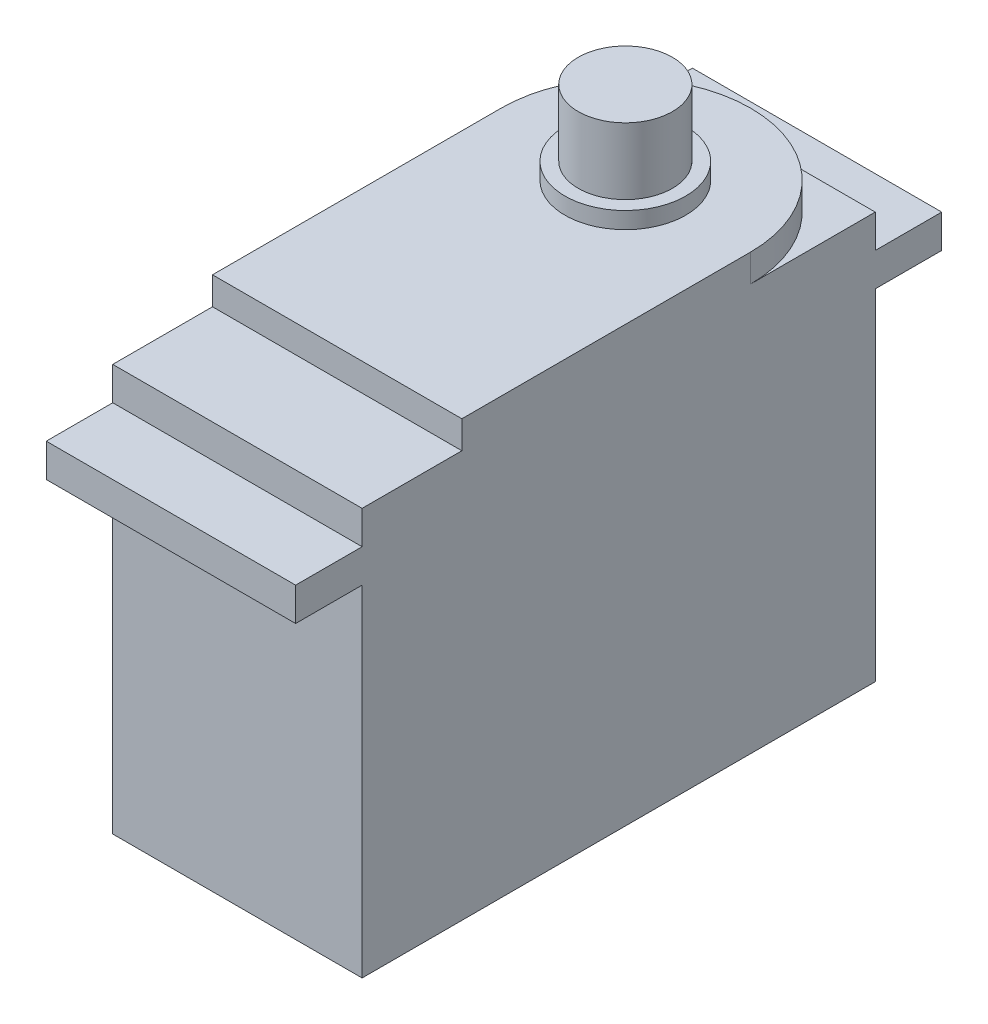
ISO-10303-21;
HEADER;
FILE_DESCRIPTION(('STEP AP214'),'2;1');
FILE_NAME('part.step','',(''),(''),'','','');
FILE_SCHEMA(('AUTOMOTIVE_DESIGN { 1 0 10303 214 1 1 1 1 }'));
ENDSEC;
DATA;
#1=APPLICATION_CONTEXT('core data for automotive mechanical design processes');
#2=APPLICATION_PROTOCOL_DEFINITION('international standard','automotive_design',2000,#1);
#3=PRODUCT_CONTEXT('',#1,'mechanical');
#4=PRODUCT('Part','Part','',(#3));
#5=PRODUCT_RELATED_PRODUCT_CATEGORY('part','',(#4));
#6=PRODUCT_DEFINITION_FORMATION('','',#4);
#7=PRODUCT_DEFINITION_CONTEXT('part definition',#1,'design');
#8=PRODUCT_DEFINITION('design','',#6,#7);
#9=PRODUCT_DEFINITION_SHAPE('','',#8);
#10=(LENGTH_UNIT() NAMED_UNIT(*) SI_UNIT(.MILLI.,.METRE.));
#11=(NAMED_UNIT(*) PLANE_ANGLE_UNIT() SI_UNIT($,.RADIAN.));
#12=(NAMED_UNIT(*) SI_UNIT($,.STERADIAN.) SOLID_ANGLE_UNIT());
#13=UNCERTAINTY_MEASURE_WITH_UNIT(LENGTH_MEASURE(1.E-05),#10,'distance_accuracy_value','');
#14=(GEOMETRIC_REPRESENTATION_CONTEXT(3) GLOBAL_UNCERTAINTY_ASSIGNED_CONTEXT((#13)) GLOBAL_UNIT_ASSIGNED_CONTEXT((#10,
#11,#12)) REPRESENTATION_CONTEXT('',''));
#15=CARTESIAN_POINT('',(0.,0.,0.));
#16=DIRECTION('',(0.,0.,1.));
#17=DIRECTION('',(1.,0.,0.));
#18=AXIS2_PLACEMENT_3D('',#15,#16,#17);
#19=CARTESIAN_POINT('',(0.,51.689,-15.0495));
#20=DIRECTION('',(0.,1.,0.));
#21=DIRECTION('',(0.,0.,1.));
#22=AXIS2_PLACEMENT_3D('',#19,#20,#21);
#23=PLANE('',#22);
#24=CARTESIAN_POINT('',(0.,51.689,-15.0495));
#25=DIRECTION('',(0.,1.,0.));
#26=DIRECTION('',(0.,0.,1.));
#27=AXIS2_PLACEMENT_3D('',#24,#25,#26);
#28=CIRCLE('',#27,6.9215);
#29=CARTESIAN_POINT('',(0.,51.689,-21.971));
#30=VERTEX_POINT('',#29);
#31=EDGE_CURVE('E187',#30,#30,#28,.T.);
#32=ORIENTED_EDGE('',*,*,#31,.T.);
#33=EDGE_LOOP('',(#32));
#34=FACE_BOUND('',#33,.T.);
#35=CARTESIAN_POINT('',(0.,51.689,-15.0495));
#36=DIRECTION('',(0.,1.,0.));
#37=DIRECTION('',(0.,0.,1.));
#38=AXIS2_PLACEMENT_3D('',#35,#36,#37);
#39=CIRCLE('',#38,5.3975);
#40=CARTESIAN_POINT('',(0.,51.689,-20.447));
#41=VERTEX_POINT('',#40);
#42=EDGE_CURVE('E214',#41,#41,#39,.T.);
#43=ORIENTED_EDGE('',*,*,#42,.F.);
#44=EDGE_LOOP('',(#43));
#45=FACE_BOUND('',#44,.T.);
#46=ADVANCED_FACE('F33',(#34,#45),#23,.T.);
#47=CARTESIAN_POINT('',(0.,49.784,-15.113));
#48=DIRECTION('',(0.,-1.,0.));
#49=DIRECTION('',(0.,0.,-1.));
#50=AXIS2_PLACEMENT_3D('',#47,#48,#49);
#51=PLANE('',#50);
#52=CARTESIAN_POINT('',(0.,49.784,-15.113));
#53=DIRECTION('',(0.,1.,0.));
#54=DIRECTION('',(0.,0.,-1.));
#55=AXIS2_PLACEMENT_3D('',#52,#53,#54);
#56=CIRCLE('',#55,14.2875);
#57=CARTESIAN_POINT('',(14.2875,49.784,-15.113));
#58=VERTEX_POINT('',#57);
#59=CARTESIAN_POINT('',(-14.2875,49.784,-15.113));
#60=VERTEX_POINT('',#59);
#61=EDGE_CURVE('E160',#58,#60,#56,.T.);
#62=ORIENTED_EDGE('',*,*,#61,.T.);
#63=DIRECTION('',(0.,0.,1.));
#64=VECTOR('',#63,1.);
#65=CARTESIAN_POINT('',(-14.2875,49.784,-15.113));
#66=LINE('',#65,#64);
#67=CARTESIAN_POINT('',(-14.2875,49.784,17.9705));
#68=VERTEX_POINT('',#67);
#69=EDGE_CURVE('E149',#60,#68,#66,.T.);
#70=ORIENTED_EDGE('',*,*,#69,.T.);
#71=DIRECTION('',(1.,0.,0.));
#72=VECTOR('',#71,1.);
#73=CARTESIAN_POINT('',(-14.2875,49.784,17.9705));
#74=LINE('',#73,#72);
#75=CARTESIAN_POINT('',(14.2875,49.784,17.9705));
#76=VERTEX_POINT('',#75);
#77=EDGE_CURVE('E159',#68,#76,#74,.T.);
#78=ORIENTED_EDGE('',*,*,#77,.T.);
#79=DIRECTION('',(0.,0.,-1.));
#80=VECTOR('',#79,1.);
#81=CARTESIAN_POINT('',(14.2875,49.784,17.9705));
#82=LINE('',#81,#80);
#83=EDGE_CURVE('E166',#76,#58,#82,.T.);
#84=ORIENTED_EDGE('',*,*,#83,.T.);
#85=EDGE_LOOP('',(#62,#70,#78,#84));
#86=FACE_BOUND('',#85,.T.);
#87=CARTESIAN_POINT('',(0.,49.784,-15.0495));
#88=DIRECTION('',(0.,-1.,0.));
#89=DIRECTION('',(0.,0.,-1.));
#90=AXIS2_PLACEMENT_3D('',#87,#88,#89);
#91=CIRCLE('',#90,6.9215);
#92=CARTESIAN_POINT('',(0.,49.784,-21.971));
#93=VERTEX_POINT('',#92);
#94=EDGE_CURVE('E11',#93,#93,#91,.F.);
#95=ORIENTED_EDGE('',*,*,#94,.F.);
#96=EDGE_LOOP('',(#95));
#97=FACE_BOUND('',#96,.T.);
#98=ADVANCED_FACE('F163',(#86,#97),#51,.F.);
#99=CARTESIAN_POINT('',(0.,46.609,0.));
#100=DIRECTION('',(0.,-1.,0.));
#101=DIRECTION('',(0.,0.,-1.));
#102=AXIS2_PLACEMENT_3D('',#99,#100,#101);
#103=PLANE('',#102);
#104=CARTESIAN_POINT('',(0.,46.609,-15.113));
#105=DIRECTION('',(0.,1.,0.));
#106=DIRECTION('',(0.,0.,-1.));
#107=AXIS2_PLACEMENT_3D('',#104,#105,#106);
#108=CIRCLE('',#107,14.2875);
#109=CARTESIAN_POINT('',(14.2875,46.609,-15.113));
#110=VERTEX_POINT('',#109);
#111=CARTESIAN_POINT('',(0.,46.609,-29.4005));
#112=VERTEX_POINT('',#111);
#113=EDGE_CURVE('E184',#110,#112,#108,.T.);
#114=ORIENTED_EDGE('',*,*,#113,.F.);
#115=DIRECTION('',(0.,0.,-1.));
#116=VECTOR('',#115,1.);
#117=CARTESIAN_POINT('',(14.2875,46.609,29.4005));
#118=LINE('',#117,#116);
#119=CARTESIAN_POINT('',(14.2875,46.609,-29.4005));
#120=VERTEX_POINT('',#119);
#121=EDGE_CURVE('E342',#110,#120,#118,.T.);
#122=ORIENTED_EDGE('',*,*,#121,.T.);
#123=DIRECTION('',(-1.,0.,0.));
#124=VECTOR('',#123,1.);
#125=CARTESIAN_POINT('',(-14.2875,46.609,-29.4005));
#126=LINE('',#125,#124);
#127=EDGE_CURVE('E339',#120,#112,#126,.T.);
#128=ORIENTED_EDGE('',*,*,#127,.T.);
#129=EDGE_LOOP('',(#114,#122,#128));
#130=FACE_BOUND('',#129,.T.);
#131=ADVANCED_FACE('F235',(#130),#103,.F.);
#132=CARTESIAN_POINT('',(-14.2875,46.609,-15.113));
#133=VERTEX_POINT('',#132);
#134=EDGE_CURVE('E41',#112,#133,#108,.T.);
#135=ORIENTED_EDGE('',*,*,#134,.F.);
#136=CARTESIAN_POINT('',(-14.2875,46.609,-29.4005));
#137=VERTEX_POINT('',#136);
#138=EDGE_CURVE('E346',#112,#137,#126,.T.);
#139=ORIENTED_EDGE('',*,*,#138,.T.);
#140=DIRECTION('',(0.,0.,1.));
#141=VECTOR('',#140,1.);
#142=CARTESIAN_POINT('',(-14.2875,46.609,29.4005));
#143=LINE('',#142,#141);
#144=EDGE_CURVE('E56',#137,#133,#143,.T.);
#145=ORIENTED_EDGE('',*,*,#144,.T.);
#146=EDGE_LOOP('',(#135,#139,#145));
#147=FACE_BOUND('',#146,.T.);
#148=ADVANCED_FACE('F269',(#147),#103,.F.);
#149=DIRECTION('',(1.,0.,0.));
#150=VECTOR('',#149,1.);
#151=CARTESIAN_POINT('',(-14.2875,46.609,17.9705));
#152=LINE('',#151,#150);
#153=CARTESIAN_POINT('',(-14.2875,46.609,17.9705));
#154=VERTEX_POINT('',#153);
#155=CARTESIAN_POINT('',(14.2875,46.609,17.9705));
#156=VERTEX_POINT('',#155);
#157=EDGE_CURVE('E48',#154,#156,#152,.T.);
#158=ORIENTED_EDGE('',*,*,#157,.F.);
#159=CARTESIAN_POINT('',(-14.2875,46.609,29.4005));
#160=VERTEX_POINT('',#159);
#161=EDGE_CURVE('E200',#154,#160,#143,.T.);
#162=ORIENTED_EDGE('',*,*,#161,.T.);
#163=DIRECTION('',(1.,0.,0.));
#164=VECTOR('',#163,1.);
#165=CARTESIAN_POINT('',(-14.2875,46.609,29.4005));
#166=LINE('',#165,#164);
#167=CARTESIAN_POINT('',(14.2875,46.609,29.4005));
#168=VERTEX_POINT('',#167);
#169=EDGE_CURVE('E370',#160,#168,#166,.T.);
#170=ORIENTED_EDGE('',*,*,#169,.T.);
#171=EDGE_CURVE('E344',#168,#156,#118,.T.);
#172=ORIENTED_EDGE('',*,*,#171,.T.);
#173=EDGE_LOOP('',(#158,#162,#170,#172));
#174=FACE_BOUND('',#173,.T.);
#175=ADVANCED_FACE('F271',(#174),#103,.F.);
#176=CARTESIAN_POINT('',(-14.2875,46.609,-29.4005));
#177=DIRECTION('',(0.,0.,1.));
#178=DIRECTION('',(1.,0.,0.));
#179=AXIS2_PLACEMENT_3D('',#176,#177,#178);
#180=PLANE('',#179);
#181=DIRECTION('',(1.,0.,0.));
#182=VECTOR('',#181,1.);
#183=CARTESIAN_POINT('',(-14.2875,42.799,-29.4005));
#184=LINE('',#183,#182);
#185=CARTESIAN_POINT('',(-14.2875,42.799,-29.4005));
#186=VERTEX_POINT('',#185);
#187=CARTESIAN_POINT('',(14.2875,42.799,-29.4005));
#188=VERTEX_POINT('',#187);
#189=EDGE_CURVE('E297',#186,#188,#184,.T.);
#190=ORIENTED_EDGE('',*,*,#189,.F.);
#191=DIRECTION('',(0.,-1.,0.));
#192=VECTOR('',#191,1.);
#193=CARTESIAN_POINT('',(-14.2875,46.609,-29.4005));
#194=LINE('',#193,#192);
#195=EDGE_CURVE('E300',#137,#186,#194,.T.);
#196=ORIENTED_EDGE('',*,*,#195,.F.);
#197=ORIENTED_EDGE('',*,*,#138,.F.);
#198=ORIENTED_EDGE('',*,*,#127,.F.);
#199=DIRECTION('',(0.,-1.,0.));
#200=VECTOR('',#199,1.);
#201=CARTESIAN_POINT('',(14.2875,46.609,-29.4005));
#202=LINE('',#201,#200);
#203=EDGE_CURVE('E303',#120,#188,#202,.T.);
#204=ORIENTED_EDGE('',*,*,#203,.T.);
#205=EDGE_LOOP('',(#190,#196,#197,#198,#204));
#206=FACE_BOUND('',#205,.T.);
#207=ADVANCED_FACE('F284',(#206),#180,.F.);
#208=CARTESIAN_POINT('',(-14.2875,46.609,29.4005));
#209=DIRECTION('',(0.,0.,-1.));
#210=DIRECTION('',(-1.,0.,0.));
#211=AXIS2_PLACEMENT_3D('',#208,#209,#210);
#212=PLANE('',#211);
#213=DIRECTION('',(-1.,0.,0.));
#214=VECTOR('',#213,1.);
#215=CARTESIAN_POINT('',(-14.2875,42.799,29.4005));
#216=LINE('',#215,#214);
#217=CARTESIAN_POINT('',(14.2875,42.799,29.4005));
#218=VERTEX_POINT('',#217);
#219=CARTESIAN_POINT('',(-14.2875,42.799,29.4005));
#220=VERTEX_POINT('',#219);
#221=EDGE_CURVE('E348',#218,#220,#216,.T.);
#222=ORIENTED_EDGE('',*,*,#221,.F.);
#223=DIRECTION('',(0.,-1.,0.));
#224=VECTOR('',#223,1.);
#225=CARTESIAN_POINT('',(14.2875,46.609,29.4005));
#226=LINE('',#225,#224);
#227=EDGE_CURVE('E355',#168,#218,#226,.T.);
#228=ORIENTED_EDGE('',*,*,#227,.F.);
#229=ORIENTED_EDGE('',*,*,#169,.F.);
#230=DIRECTION('',(0.,-1.,0.));
#231=VECTOR('',#230,1.);
#232=CARTESIAN_POINT('',(-14.2875,46.609,29.4005));
#233=LINE('',#232,#231);
#234=EDGE_CURVE('E352',#160,#220,#233,.T.);
#235=ORIENTED_EDGE('',*,*,#234,.T.);
#236=EDGE_LOOP('',(#222,#228,#229,#235));
#237=FACE_BOUND('',#236,.T.);
#238=ADVANCED_FACE('F279',(#237),#212,.F.);
#239=CARTESIAN_POINT('',(14.2875,46.609,29.4005));
#240=DIRECTION('',(-1.,0.,0.));
#241=DIRECTION('',(0.,0.,1.));
#242=AXIS2_PLACEMENT_3D('',#239,#240,#241);
#243=PLANE('',#242);
#244=CARTESIAN_POINT('',(14.2875,38.989,-29.4005));
#245=VERTEX_POINT('',#244);
#246=CARTESIAN_POINT('',(14.2875,0.,-29.4005));
#247=VERTEX_POINT('',#246);
#248=EDGE_CURVE('E312',#245,#247,#202,.T.);
#249=ORIENTED_EDGE('',*,*,#248,.F.);
#250=DIRECTION('',(0.,0.,-1.));
#251=VECTOR('',#250,1.);
#252=CARTESIAN_POINT('',(14.2875,38.989,37.0205));
#253=LINE('',#252,#251);
#254=CARTESIAN_POINT('',(14.2875,38.989,-37.0205));
#255=VERTEX_POINT('',#254);
#256=EDGE_CURVE('E321',#245,#255,#253,.T.);
#257=ORIENTED_EDGE('',*,*,#256,.T.);
#258=DIRECTION('',(0.,1.,0.));
#259=VECTOR('',#258,1.);
#260=CARTESIAN_POINT('',(14.2875,38.989,-37.0205));
#261=LINE('',#260,#259);
#262=CARTESIAN_POINT('',(14.2875,42.799,-37.0205));
#263=VERTEX_POINT('',#262);
#264=EDGE_CURVE('E331',#255,#263,#261,.T.);
#265=ORIENTED_EDGE('',*,*,#264,.T.);
#266=DIRECTION('',(0.,0.,-1.));
#267=VECTOR('',#266,1.);
#268=CARTESIAN_POINT('',(14.2875,42.799,37.0205));
#269=LINE('',#268,#267);
#270=EDGE_CURVE('E173',#188,#263,#269,.T.);
#271=ORIENTED_EDGE('',*,*,#270,.F.);
#272=ORIENTED_EDGE('',*,*,#203,.F.);
#273=ORIENTED_EDGE('',*,*,#121,.F.);
#274=DIRECTION('',(0.,-1.,0.));
#275=VECTOR('',#274,1.);
#276=CARTESIAN_POINT('',(14.2875,49.784,-15.113));
#277=LINE('',#276,#275);
#278=EDGE_CURVE('E188',#58,#110,#277,.T.);
#279=ORIENTED_EDGE('',*,*,#278,.F.);
#280=ORIENTED_EDGE('',*,*,#83,.F.);
#281=DIRECTION('',(0.,-1.,0.));
#282=VECTOR('',#281,1.);
#283=CARTESIAN_POINT('',(14.2875,49.784,17.9705));
#284=LINE('',#283,#282);
#285=EDGE_CURVE('E177',#76,#156,#284,.T.);
#286=ORIENTED_EDGE('',*,*,#285,.T.);
#287=ORIENTED_EDGE('',*,*,#171,.F.);
#288=ORIENTED_EDGE('',*,*,#227,.T.);
#289=CARTESIAN_POINT('',(14.2875,42.799,37.0205));
#290=VERTEX_POINT('',#289);
#291=EDGE_CURVE('E175',#290,#218,#269,.T.);
#292=ORIENTED_EDGE('',*,*,#291,.F.);
#293=DIRECTION('',(0.,1.,0.));
#294=VECTOR('',#293,1.);
#295=CARTESIAN_POINT('',(14.2875,38.989,37.0205));
#296=LINE('',#295,#294);
#297=CARTESIAN_POINT('',(14.2875,38.989,37.0205));
#298=VERTEX_POINT('',#297);
#299=EDGE_CURVE('E307',#298,#290,#296,.T.);
#300=ORIENTED_EDGE('',*,*,#299,.F.);
#301=CARTESIAN_POINT('',(14.2875,38.989,29.4005));
#302=VERTEX_POINT('',#301);
#303=EDGE_CURVE('E392',#298,#302,#253,.T.);
#304=ORIENTED_EDGE('',*,*,#303,.T.);
#305=CARTESIAN_POINT('',(14.2875,0.,29.4005));
#306=VERTEX_POINT('',#305);
#307=EDGE_CURVE('E358',#302,#306,#226,.T.);
#308=ORIENTED_EDGE('',*,*,#307,.T.);
#309=DIRECTION('',(0.,0.,-1.));
#310=VECTOR('',#309,1.);
#311=CARTESIAN_POINT('',(14.2875,0.,29.4005));
#312=LINE('',#311,#310);
#313=EDGE_CURVE('E336',#306,#247,#312,.T.);
#314=ORIENTED_EDGE('',*,*,#313,.T.);
#315=EDGE_LOOP('',(#249,#257,#265,#271,#272,#273,#279,#280,#286,#287,#288,#292,#300,#304,#308,#314));
#316=FACE_BOUND('',#315,.T.);
#317=ADVANCED_FACE('F35',(#316),#243,.F.);
#318=CARTESIAN_POINT('',(-14.2875,38.989,-29.4005));
#319=VERTEX_POINT('',#318);
#320=CARTESIAN_POINT('',(-14.2875,0.,-29.4005));
#321=VERTEX_POINT('',#320);
#322=EDGE_CURVE('E313',#319,#321,#194,.T.);
#323=ORIENTED_EDGE('',*,*,#322,.F.);
#324=DIRECTION('',(1.,0.,0.));
#325=VECTOR('',#324,1.);
#326=CARTESIAN_POINT('',(-14.2875,38.989,-29.4005));
#327=LINE('',#326,#325);
#328=EDGE_CURVE('E306',#319,#245,#327,.T.);
#329=ORIENTED_EDGE('',*,*,#328,.T.);
#330=ORIENTED_EDGE('',*,*,#248,.T.);
#331=DIRECTION('',(-1.,0.,0.));
#332=VECTOR('',#331,1.);
#333=CARTESIAN_POINT('',(-14.2875,0.,-29.4005));
#334=LINE('',#333,#332);
#335=EDGE_CURVE('E365',#247,#321,#334,.T.);
#336=ORIENTED_EDGE('',*,*,#335,.T.);
#337=EDGE_LOOP('',(#323,#329,#330,#336));
#338=FACE_BOUND('',#337,.T.);
#339=ADVANCED_FACE('F281',(#338),#180,.F.);
#340=CARTESIAN_POINT('',(-14.2875,46.609,29.4005));
#341=DIRECTION('',(1.,0.,0.));
#342=DIRECTION('',(0.,0.,-1.));
#343=AXIS2_PLACEMENT_3D('',#340,#341,#342);
#344=PLANE('',#343);
#345=CARTESIAN_POINT('',(-14.2875,38.989,29.4005));
#346=VERTEX_POINT('',#345);
#347=CARTESIAN_POINT('',(-14.2875,0.,29.4005));
#348=VERTEX_POINT('',#347);
#349=EDGE_CURVE('E354',#346,#348,#233,.T.);
#350=ORIENTED_EDGE('',*,*,#349,.F.);
#351=DIRECTION('',(0.,0.,1.));
#352=VECTOR('',#351,1.);
#353=CARTESIAN_POINT('',(-14.2875,38.989,37.0205));
#354=LINE('',#353,#352);
#355=CARTESIAN_POINT('',(-14.2875,38.989,37.0205));
#356=VERTEX_POINT('',#355);
#357=EDGE_CURVE('E390',#346,#356,#354,.T.);
#358=ORIENTED_EDGE('',*,*,#357,.T.);
#359=DIRECTION('',(0.,1.,0.));
#360=VECTOR('',#359,1.);
#361=CARTESIAN_POINT('',(-14.2875,38.989,37.0205));
#362=LINE('',#361,#360);
#363=CARTESIAN_POINT('',(-14.2875,42.799,37.0205));
#364=VERTEX_POINT('',#363);
#365=EDGE_CURVE('E326',#356,#364,#362,.T.);
#366=ORIENTED_EDGE('',*,*,#365,.T.);
#367=DIRECTION('',(0.,0.,1.));
#368=VECTOR('',#367,1.);
#369=CARTESIAN_POINT('',(-14.2875,42.799,37.0205));
#370=LINE('',#369,#368);
#371=EDGE_CURVE('E318',#220,#364,#370,.T.);
#372=ORIENTED_EDGE('',*,*,#371,.F.);
#373=ORIENTED_EDGE('',*,*,#234,.F.);
#374=ORIENTED_EDGE('',*,*,#161,.F.);
#375=DIRECTION('',(0.,-1.,0.));
#376=VECTOR('',#375,1.);
#377=CARTESIAN_POINT('',(-14.2875,49.784,17.9705));
#378=LINE('',#377,#376);
#379=EDGE_CURVE('E156',#68,#154,#378,.T.);
#380=ORIENTED_EDGE('',*,*,#379,.F.);
#381=ORIENTED_EDGE('',*,*,#69,.F.);
#382=DIRECTION('',(0.,-1.,0.));
#383=VECTOR('',#382,1.);
#384=CARTESIAN_POINT('',(-14.2875,49.784,-15.113));
#385=LINE('',#384,#383);
#386=EDGE_CURVE('E154',#60,#133,#385,.T.);
#387=ORIENTED_EDGE('',*,*,#386,.T.);
#388=ORIENTED_EDGE('',*,*,#144,.F.);
#389=ORIENTED_EDGE('',*,*,#195,.T.);
#390=CARTESIAN_POINT('',(-14.2875,42.799,-37.0205));
#391=VERTEX_POINT('',#390);
#392=EDGE_CURVE('E310',#391,#186,#370,.T.);
#393=ORIENTED_EDGE('',*,*,#392,.F.);
#394=DIRECTION('',(0.,1.,0.));
#395=VECTOR('',#394,1.);
#396=CARTESIAN_POINT('',(-14.2875,38.989,-37.0205));
#397=LINE('',#396,#395);
#398=CARTESIAN_POINT('',(-14.2875,38.989,-37.0205));
#399=VERTEX_POINT('',#398);
#400=EDGE_CURVE('E329',#399,#391,#397,.T.);
#401=ORIENTED_EDGE('',*,*,#400,.F.);
#402=EDGE_CURVE('E387',#399,#319,#354,.T.);
#403=ORIENTED_EDGE('',*,*,#402,.T.);
#404=ORIENTED_EDGE('',*,*,#322,.T.);
#405=DIRECTION('',(0.,0.,1.));
#406=VECTOR('',#405,1.);
#407=CARTESIAN_POINT('',(-14.2875,0.,29.4005));
#408=LINE('',#407,#406);
#409=EDGE_CURVE('E362',#321,#348,#408,.T.);
#410=ORIENTED_EDGE('',*,*,#409,.T.);
#411=EDGE_LOOP('',(#350,#358,#366,#372,#373,#374,#380,#381,#387,#388,#389,#393,#401,#403,#404,#410));
#412=FACE_BOUND('',#411,.T.);
#413=ADVANCED_FACE('F152',(#412),#344,.F.);
#414=ORIENTED_EDGE('',*,*,#307,.F.);
#415=DIRECTION('',(-1.,0.,0.));
#416=VECTOR('',#415,1.);
#417=CARTESIAN_POINT('',(-14.2875,38.989,29.4005));
#418=LINE('',#417,#416);
#419=EDGE_CURVE('E199',#302,#346,#418,.T.);
#420=ORIENTED_EDGE('',*,*,#419,.T.);
#421=ORIENTED_EDGE('',*,*,#349,.T.);
#422=DIRECTION('',(1.,0.,0.));
#423=VECTOR('',#422,1.);
#424=CARTESIAN_POINT('',(-14.2875,0.,29.4005));
#425=LINE('',#424,#423);
#426=EDGE_CURVE('E359',#348,#306,#425,.T.);
#427=ORIENTED_EDGE('',*,*,#426,.T.);
#428=EDGE_LOOP('',(#414,#420,#421,#427));
#429=FACE_BOUND('',#428,.T.);
#430=ADVANCED_FACE('F274',(#429),#212,.F.);
#431=CARTESIAN_POINT('',(0.,0.,0.));
#432=DIRECTION('',(0.,-1.,0.));
#433=DIRECTION('',(0.,0.,-1.));
#434=AXIS2_PLACEMENT_3D('',#431,#432,#433);
#435=PLANE('',#434);
#436=ORIENTED_EDGE('',*,*,#313,.F.);
#437=ORIENTED_EDGE('',*,*,#426,.F.);
#438=ORIENTED_EDGE('',*,*,#409,.F.);
#439=ORIENTED_EDGE('',*,*,#335,.F.);
#440=EDGE_LOOP('',(#436,#437,#438,#439));
#441=FACE_BOUND('',#440,.T.);
#442=ADVANCED_FACE('F262',(#441),#435,.T.);
#443=CARTESIAN_POINT('',(-14.2875,38.989,37.0205));
#444=DIRECTION('',(0.,0.,1.));
#445=DIRECTION('',(1.,0.,0.));
#446=AXIS2_PLACEMENT_3D('',#443,#444,#445);
#447=PLANE('',#446);
#448=DIRECTION('',(1.,0.,0.));
#449=VECTOR('',#448,1.);
#450=CARTESIAN_POINT('',(-14.2875,42.799,37.0205));
#451=LINE('',#450,#449);
#452=EDGE_CURVE('E317',#364,#290,#451,.T.);
#453=ORIENTED_EDGE('',*,*,#452,.F.);
#454=ORIENTED_EDGE('',*,*,#365,.F.);
#455=DIRECTION('',(1.,0.,0.));
#456=VECTOR('',#455,1.);
#457=CARTESIAN_POINT('',(-14.2875,38.989,37.0205));
#458=LINE('',#457,#456);
#459=EDGE_CURVE('E333',#356,#298,#458,.T.);
#460=ORIENTED_EDGE('',*,*,#459,.T.);
#461=ORIENTED_EDGE('',*,*,#299,.T.);
#462=EDGE_LOOP('',(#453,#454,#460,#461));
#463=FACE_BOUND('',#462,.T.);
#464=ADVANCED_FACE('F259',(#463),#447,.T.);
#465=CARTESIAN_POINT('',(0.,42.799,0.));
#466=DIRECTION('',(0.,-1.,0.));
#467=DIRECTION('',(0.,0.,-1.));
#468=AXIS2_PLACEMENT_3D('',#465,#466,#467);
#469=PLANE('',#468);
#470=ORIENTED_EDGE('',*,*,#291,.T.);
#471=ORIENTED_EDGE('',*,*,#221,.T.);
#472=ORIENTED_EDGE('',*,*,#371,.T.);
#473=ORIENTED_EDGE('',*,*,#452,.T.);
#474=EDGE_LOOP('',(#470,#471,#472,#473));
#475=FACE_BOUND('',#474,.T.);
#476=ADVANCED_FACE('F258',(#475),#469,.F.);
#477=CARTESIAN_POINT('',(0.,38.989,0.));
#478=DIRECTION('',(0.,-1.,0.));
#479=DIRECTION('',(0.,0.,-1.));
#480=AXIS2_PLACEMENT_3D('',#477,#478,#479);
#481=PLANE('',#480);
#482=ORIENTED_EDGE('',*,*,#419,.F.);
#483=ORIENTED_EDGE('',*,*,#303,.F.);
#484=ORIENTED_EDGE('',*,*,#459,.F.);
#485=ORIENTED_EDGE('',*,*,#357,.F.);
#486=EDGE_LOOP('',(#482,#483,#484,#485));
#487=FACE_BOUND('',#486,.T.);
#488=ADVANCED_FACE('F253',(#487),#481,.T.);
#489=ORIENTED_EDGE('',*,*,#328,.F.);
#490=ORIENTED_EDGE('',*,*,#402,.F.);
#491=DIRECTION('',(-1.,0.,0.));
#492=VECTOR('',#491,1.);
#493=CARTESIAN_POINT('',(-14.2875,38.989,-37.0205));
#494=LINE('',#493,#492);
#495=EDGE_CURVE('E391',#255,#399,#494,.T.);
#496=ORIENTED_EDGE('',*,*,#495,.F.);
#497=ORIENTED_EDGE('',*,*,#256,.F.);
#498=EDGE_LOOP('',(#489,#490,#496,#497));
#499=FACE_BOUND('',#498,.T.);
#500=ADVANCED_FACE('F249',(#499),#481,.T.);
#501=ORIENTED_EDGE('',*,*,#392,.T.);
#502=ORIENTED_EDGE('',*,*,#189,.T.);
#503=ORIENTED_EDGE('',*,*,#270,.T.);
#504=DIRECTION('',(-1.,0.,0.));
#505=VECTOR('',#504,1.);
#506=CARTESIAN_POINT('',(-14.2875,42.799,-37.0205));
#507=LINE('',#506,#505);
#508=EDGE_CURVE('E316',#263,#391,#507,.T.);
#509=ORIENTED_EDGE('',*,*,#508,.T.);
#510=EDGE_LOOP('',(#501,#502,#503,#509));
#511=FACE_BOUND('',#510,.T.);
#512=ADVANCED_FACE('F252',(#511),#469,.F.);
#513=CARTESIAN_POINT('',(-14.2875,38.989,-37.0205));
#514=DIRECTION('',(0.,0.,-1.));
#515=DIRECTION('',(-1.,0.,0.));
#516=AXIS2_PLACEMENT_3D('',#513,#514,#515);
#517=PLANE('',#516);
#518=ORIENTED_EDGE('',*,*,#508,.F.);
#519=ORIENTED_EDGE('',*,*,#264,.F.);
#520=ORIENTED_EDGE('',*,*,#495,.T.);
#521=ORIENTED_EDGE('',*,*,#400,.T.);
#522=EDGE_LOOP('',(#518,#519,#520,#521));
#523=FACE_BOUND('',#522,.T.);
#524=ADVANCED_FACE('F248',(#523),#517,.T.);
#525=CARTESIAN_POINT('',(0.,49.784,-15.113));
#526=DIRECTION('',(0.,-1.,0.));
#527=DIRECTION('',(0.,0.,-1.));
#528=AXIS2_PLACEMENT_3D('',#525,#526,#527);
#529=CYLINDRICAL_SURFACE('',#528,14.2875);
#530=ORIENTED_EDGE('',*,*,#113,.T.);
#531=ORIENTED_EDGE('',*,*,#134,.T.);
#532=ORIENTED_EDGE('',*,*,#386,.F.);
#533=ORIENTED_EDGE('',*,*,#61,.F.);
#534=ORIENTED_EDGE('',*,*,#278,.T.);
#535=EDGE_LOOP('',(#530,#531,#532,#533,#534));
#536=FACE_BOUND('',#535,.T.);
#537=ADVANCED_FACE('F172',(#536),#529,.T.);
#538=CARTESIAN_POINT('',(-14.2875,49.784,17.9705));
#539=DIRECTION('',(0.,0.,-1.));
#540=DIRECTION('',(-1.,0.,0.));
#541=AXIS2_PLACEMENT_3D('',#538,#539,#540);
#542=PLANE('',#541);
#543=ORIENTED_EDGE('',*,*,#157,.T.);
#544=ORIENTED_EDGE('',*,*,#285,.F.);
#545=ORIENTED_EDGE('',*,*,#77,.F.);
#546=ORIENTED_EDGE('',*,*,#379,.T.);
#547=EDGE_LOOP('',(#543,#544,#545,#546));
#548=FACE_BOUND('',#547,.T.);
#549=ADVANCED_FACE('F240',(#548),#542,.F.);
#550=CARTESIAN_POINT('',(0.,51.689,-15.0495));
#551=DIRECTION('',(0.,-1.,0.));
#552=DIRECTION('',(0.,0.,-1.));
#553=AXIS2_PLACEMENT_3D('',#550,#551,#552);
#554=CYLINDRICAL_SURFACE('',#553,6.9215);
#555=CARTESIAN_POINT('',(0.,51.689,-21.971));
#556=CARTESIAN_POINT('',(0.,51.66915625,-21.971));
#557=CARTESIAN_POINT('',(0.,51.6493125,-21.971));
#558=CARTESIAN_POINT('',(0.,51.609625,-21.971));
#559=CARTESIAN_POINT('',(0.,51.58978125,-21.971));
#560=CARTESIAN_POINT('',(0.,51.55009375,-21.971));
#561=CARTESIAN_POINT('',(0.,51.53025,-21.971));
#562=CARTESIAN_POINT('',(0.,51.4905625,-21.971));
#563=CARTESIAN_POINT('',(0.,51.47071875,-21.971));
#564=CARTESIAN_POINT('',(0.,51.43103125,-21.971));
#565=CARTESIAN_POINT('',(0.,51.4111875,-21.971));
#566=CARTESIAN_POINT('',(0.,51.3715,-21.971));
#567=CARTESIAN_POINT('',(0.,51.35165625,-21.971));
#568=CARTESIAN_POINT('',(0.,51.31196875,-21.971));
#569=CARTESIAN_POINT('',(0.,51.292125,-21.971));
#570=CARTESIAN_POINT('',(0.,51.2524375,-21.971));
#571=CARTESIAN_POINT('',(0.,51.23259375,-21.971));
#572=CARTESIAN_POINT('',(0.,51.19290625,-21.971));
#573=CARTESIAN_POINT('',(0.,51.1730625,-21.971));
#574=CARTESIAN_POINT('',(0.,51.133375,-21.971));
#575=CARTESIAN_POINT('',(0.,51.11353125,-21.971));
#576=CARTESIAN_POINT('',(0.,51.07384375,-21.971));
#577=CARTESIAN_POINT('',(0.,51.054,-21.971));
#578=CARTESIAN_POINT('',(0.,51.0143125,-21.971));
#579=CARTESIAN_POINT('',(0.,50.99446875,-21.971));
#580=CARTESIAN_POINT('',(0.,50.95478125,-21.971));
#581=CARTESIAN_POINT('',(0.,50.9349375,-21.971));
#582=CARTESIAN_POINT('',(0.,50.89525,-21.971));
#583=CARTESIAN_POINT('',(0.,50.87540625,-21.971));
#584=CARTESIAN_POINT('',(0.,50.83571875,-21.971));
#585=CARTESIAN_POINT('',(0.,50.815875,-21.971));
#586=CARTESIAN_POINT('',(0.,50.7761875,-21.971));
#587=CARTESIAN_POINT('',(0.,50.75634375,-21.971));
#588=CARTESIAN_POINT('',(0.,50.71665625,-21.971));
#589=CARTESIAN_POINT('',(0.,50.6968125,-21.971));
#590=CARTESIAN_POINT('',(0.,50.657125,-21.971));
#591=CARTESIAN_POINT('',(0.,50.63728125,-21.971));
#592=CARTESIAN_POINT('',(0.,50.59759375,-21.971));
#593=CARTESIAN_POINT('',(0.,50.57775,-21.971));
#594=CARTESIAN_POINT('',(0.,50.5380625,-21.971));
#595=CARTESIAN_POINT('',(0.,50.51821875,-21.971));
#596=CARTESIAN_POINT('',(0.,50.47853125,-21.971));
#597=CARTESIAN_POINT('',(0.,50.4586875,-21.971));
#598=CARTESIAN_POINT('',(0.,50.419,-21.971));
#599=CARTESIAN_POINT('',(0.,50.39915625,-21.971));
#600=CARTESIAN_POINT('',(0.,50.35946875,-21.971));
#601=CARTESIAN_POINT('',(0.,50.339625,-21.971));
#602=CARTESIAN_POINT('',(0.,50.2999375,-21.971));
#603=CARTESIAN_POINT('',(0.,50.28009375,-21.971));
#604=CARTESIAN_POINT('',(0.,50.24040625,-21.971));
#605=CARTESIAN_POINT('',(0.,50.2205625,-21.971));
#606=CARTESIAN_POINT('',(0.,50.180875,-21.971));
#607=CARTESIAN_POINT('',(0.,50.16103125,-21.971));
#608=CARTESIAN_POINT('',(0.,50.12134375,-21.971));
#609=CARTESIAN_POINT('',(0.,50.1015,-21.971));
#610=CARTESIAN_POINT('',(0.,50.0618125,-21.971));
#611=CARTESIAN_POINT('',(0.,50.04196875,-21.971));
#612=CARTESIAN_POINT('',(0.,50.00228125,-21.971));
#613=CARTESIAN_POINT('',(0.,49.9824375,-21.971));
#614=CARTESIAN_POINT('',(0.,49.94275,-21.971));
#615=CARTESIAN_POINT('',(0.,49.92290625,-21.971));
#616=CARTESIAN_POINT('',(0.,49.88321875,-21.971));
#617=CARTESIAN_POINT('',(0.,49.863375,-21.971));
#618=CARTESIAN_POINT('',(0.,49.8236875,-21.971));
#619=CARTESIAN_POINT('',(0.,49.80384375,-21.971));
#620=CARTESIAN_POINT('',(0.,49.784,-21.971));
#621=B_SPLINE_CURVE_WITH_KNOTS('',3,(#555,#556,#557,#558,#559,#560,#561,#562,#563,#564,#565,
#566,#567,#568,#569,#570,#571,#572,#573,#574,#575,#576,#577,#578,#579,#580,#581,#582,#583,#584,
#585,#586,#587,#588,#589,#590,#591,#592,#593,#594,#595,#596,#597,#598,#599,#600,#601,#602,#603,
#604,#605,#606,#607,#608,#609,#610,#611,#612,#613,#614,#615,#616,#617,#618,#619,#620),
.UNSPECIFIED.,.F.,.F.,(4,2,2,2,2,2,2,2,2,2,2,2,2,2,2,2,2,2,2,2,2,2,2,2,2,2,2,2,2,2,2,2,4),(0.,
0.0595312499999945,0.119062499999996,0.178593749999997,0.238124999999992,0.297656249999993,
0.357187499999995,0.416718749999996,0.476249999999991,0.535781249999992,0.595312499999993,
0.654843749999995,0.714374999999989,0.773906249999991,0.833437499999992,0.892968749999994,
0.952499999999988,1.01203124999999,1.07156249999999,1.13109374999999,1.19062499999999,
1.25015624999999,1.30968749999999,1.36921874999999,1.42874999999999,1.48828124999999,
1.54781249999999,1.60734374999999,1.66687499999998,1.72640624999999,1.78593749999999,
1.84546874999999,1.90499999999998),.UNSPECIFIED.);
#622=EDGE_CURVE('BSEAM225',#30,#93,#621,.T.);
#623=ORIENTED_EDGE('',*,*,#31,.F.);
#624=ORIENTED_EDGE('',*,*,#94,.T.);
#625=ORIENTED_EDGE('',*,*,#622,.T.);
#626=ORIENTED_EDGE('',*,*,#622,.F.);
#627=EDGE_LOOP('',(#623,#625,#624,#626));
#628=FACE_BOUND('',#627,.T.);
#629=ADVANCED_FACE('F225',(#628),#554,.T.);
#630=CARTESIAN_POINT('',(0.,59.309,-15.0495));
#631=DIRECTION('',(0.,-1.,0.));
#632=DIRECTION('',(0.,0.,-1.));
#633=AXIS2_PLACEMENT_3D('',#630,#631,#632);
#634=CYLINDRICAL_SURFACE('',#633,5.3975);
#635=CARTESIAN_POINT('',(0.,59.309,-15.0495));
#636=DIRECTION('',(0.,1.,0.));
#637=DIRECTION('',(0.,0.,1.));
#638=AXIS2_PLACEMENT_3D('',#635,#636,#637);
#639=CIRCLE('',#638,5.3975);
#640=CARTESIAN_POINT('',(0.,59.309,-20.447));
#641=VERTEX_POINT('',#640);
#642=EDGE_CURVE('E213',#641,#641,#639,.T.);
#643=CARTESIAN_POINT('',(0.,59.309,-20.447));
#644=CARTESIAN_POINT('',(0.,59.229625,-20.447));
#645=CARTESIAN_POINT('',(0.,59.15025,-20.447));
#646=CARTESIAN_POINT('',(0.,58.9915,-20.447));
#647=CARTESIAN_POINT('',(0.,58.912125,-20.447));
#648=CARTESIAN_POINT('',(0.,58.753375,-20.447));
#649=CARTESIAN_POINT('',(0.,58.674,-20.447));
#650=CARTESIAN_POINT('',(0.,58.51525,-20.447));
#651=CARTESIAN_POINT('',(0.,58.435875,-20.447));
#652=CARTESIAN_POINT('',(0.,58.277125,-20.447));
#653=CARTESIAN_POINT('',(0.,58.19775,-20.447));
#654=CARTESIAN_POINT('',(0.,58.039,-20.447));
#655=CARTESIAN_POINT('',(0.,57.959625,-20.447));
#656=CARTESIAN_POINT('',(0.,57.800875,-20.447));
#657=CARTESIAN_POINT('',(0.,57.7215,-20.447));
#658=CARTESIAN_POINT('',(0.,57.56275,-20.447));
#659=CARTESIAN_POINT('',(0.,57.483375,-20.447));
#660=CARTESIAN_POINT('',(0.,57.324625,-20.447));
#661=CARTESIAN_POINT('',(0.,57.24525,-20.447));
#662=CARTESIAN_POINT('',(0.,57.0865,-20.447));
#663=CARTESIAN_POINT('',(0.,57.007125,-20.447));
#664=CARTESIAN_POINT('',(0.,56.848375,-20.447));
#665=CARTESIAN_POINT('',(0.,56.769,-20.447));
#666=CARTESIAN_POINT('',(0.,56.61025,-20.447));
#667=CARTESIAN_POINT('',(0.,56.530875,-20.447));
#668=CARTESIAN_POINT('',(0.,56.372125,-20.447));
#669=CARTESIAN_POINT('',(0.,56.29275,-20.447));
#670=CARTESIAN_POINT('',(0.,56.134,-20.447));
#671=CARTESIAN_POINT('',(0.,56.054625,-20.447));
#672=CARTESIAN_POINT('',(0.,55.895875,-20.447));
#673=CARTESIAN_POINT('',(0.,55.8165,-20.447));
#674=CARTESIAN_POINT('',(0.,55.65775,-20.447));
#675=CARTESIAN_POINT('',(0.,55.578375,-20.447));
#676=CARTESIAN_POINT('',(0.,55.419625,-20.447));
#677=CARTESIAN_POINT('',(0.,55.34025,-20.447));
#678=CARTESIAN_POINT('',(0.,55.1815,-20.447));
#679=CARTESIAN_POINT('',(0.,55.102125,-20.447));
#680=CARTESIAN_POINT('',(0.,54.943375,-20.447));
#681=CARTESIAN_POINT('',(0.,54.864,-20.447));
#682=CARTESIAN_POINT('',(0.,54.70525,-20.447));
#683=CARTESIAN_POINT('',(0.,54.625875,-20.447));
#684=CARTESIAN_POINT('',(0.,54.467125,-20.447));
#685=CARTESIAN_POINT('',(0.,54.38775,-20.447));
#686=CARTESIAN_POINT('',(0.,54.229,-20.447));
#687=CARTESIAN_POINT('',(0.,54.149625,-20.447));
#688=CARTESIAN_POINT('',(0.,53.990875,-20.447));
#689=CARTESIAN_POINT('',(0.,53.9115,-20.447));
#690=CARTESIAN_POINT('',(0.,53.75275,-20.447));
#691=CARTESIAN_POINT('',(0.,53.673375,-20.447));
#692=CARTESIAN_POINT('',(0.,53.514625,-20.447));
#693=CARTESIAN_POINT('',(0.,53.43525,-20.447));
#694=CARTESIAN_POINT('',(0.,53.2765,-20.447));
#695=CARTESIAN_POINT('',(0.,53.197125,-20.447));
#696=CARTESIAN_POINT('',(0.,53.038375,-20.447));
#697=CARTESIAN_POINT('',(0.,52.959,-20.447));
#698=CARTESIAN_POINT('',(0.,52.80025,-20.447));
#699=CARTESIAN_POINT('',(0.,52.720875,-20.447));
#700=CARTESIAN_POINT('',(0.,52.562125,-20.447));
#701=CARTESIAN_POINT('',(0.,52.48275,-20.447));
#702=CARTESIAN_POINT('',(0.,52.324,-20.447));
#703=CARTESIAN_POINT('',(0.,52.244625,-20.447));
#704=CARTESIAN_POINT('',(0.,52.085875,-20.447));
#705=CARTESIAN_POINT('',(0.,52.0065,-20.447));
#706=CARTESIAN_POINT('',(0.,51.84775,-20.447));
#707=CARTESIAN_POINT('',(0.,51.768375,-20.447));
#708=CARTESIAN_POINT('',(0.,51.689,-20.447));
#709=B_SPLINE_CURVE_WITH_KNOTS('',3,(#643,#644,#645,#646,#647,#648,#649,#650,#651,#652,#653,
#654,#655,#656,#657,#658,#659,#660,#661,#662,#663,#664,#665,#666,#667,#668,#669,#670,#671,#672,
#673,#674,#675,#676,#677,#678,#679,#680,#681,#682,#683,#684,#685,#686,#687,#688,#689,#690,#691,
#692,#693,#694,#695,#696,#697,#698,#699,#700,#701,#702,#703,#704,#705,#706,#707,#708),
.UNSPECIFIED.,.F.,.F.,(4,2,2,2,2,2,2,2,2,2,2,2,2,2,2,2,2,2,2,2,2,2,2,2,2,2,2,2,2,2,2,2,4),(0.,
0.238125000000006,0.476250000000004,0.714375000000003,0.952500000000002,1.190625,
1.42875000000001,1.66687500000001,1.905,2.143125,2.38125,2.619375,2.85750000000001,3.095625,
3.33375,3.571875,3.81,4.04812500000001,4.28625000000001,4.524375,4.7625,5.000625,
5.23875000000001,5.47687500000001,5.71500000000001,5.953125,6.19125,6.429375,6.66750000000001,
6.90562500000001,7.14375,7.381875,7.62),.UNSPECIFIED.);
#710=EDGE_CURVE('BSEAM222',#641,#41,#709,.T.);
#711=ORIENTED_EDGE('',*,*,#642,.F.);
#712=ORIENTED_EDGE('',*,*,#42,.T.);
#713=ORIENTED_EDGE('',*,*,#710,.T.);
#714=ORIENTED_EDGE('',*,*,#710,.F.);
#715=EDGE_LOOP('',(#711,#713,#712,#714));
#716=FACE_BOUND('',#715,.T.);
#717=ADVANCED_FACE('F222',(#716),#634,.T.);
#718=CARTESIAN_POINT('',(0.,59.309,-15.0495));
#719=DIRECTION('',(0.,1.,0.));
#720=DIRECTION('',(0.,0.,1.));
#721=AXIS2_PLACEMENT_3D('',#718,#719,#720);
#722=PLANE('',#721);
#723=ORIENTED_EDGE('',*,*,#642,.T.);
#724=EDGE_LOOP('',(#723));
#725=FACE_BOUND('',#724,.T.);
#726=ADVANCED_FACE('F220',(#725),#722,.T.);
#727=CLOSED_SHELL('',(#46,#98,#131,#148,#175,#207,#238,#317,#339,#413,#430,#442,#464,#476,#488,
#500,#512,#524,#537,#549,#629,#717,#726));
#728=MANIFOLD_SOLID_BREP('B2',#727);
#729=ADVANCED_BREP_SHAPE_REPRESENTATION('',(#18,#728),#14);
#730=SHAPE_DEFINITION_REPRESENTATION(#9,#729);
ENDSEC;
END-ISO-10303-21;
